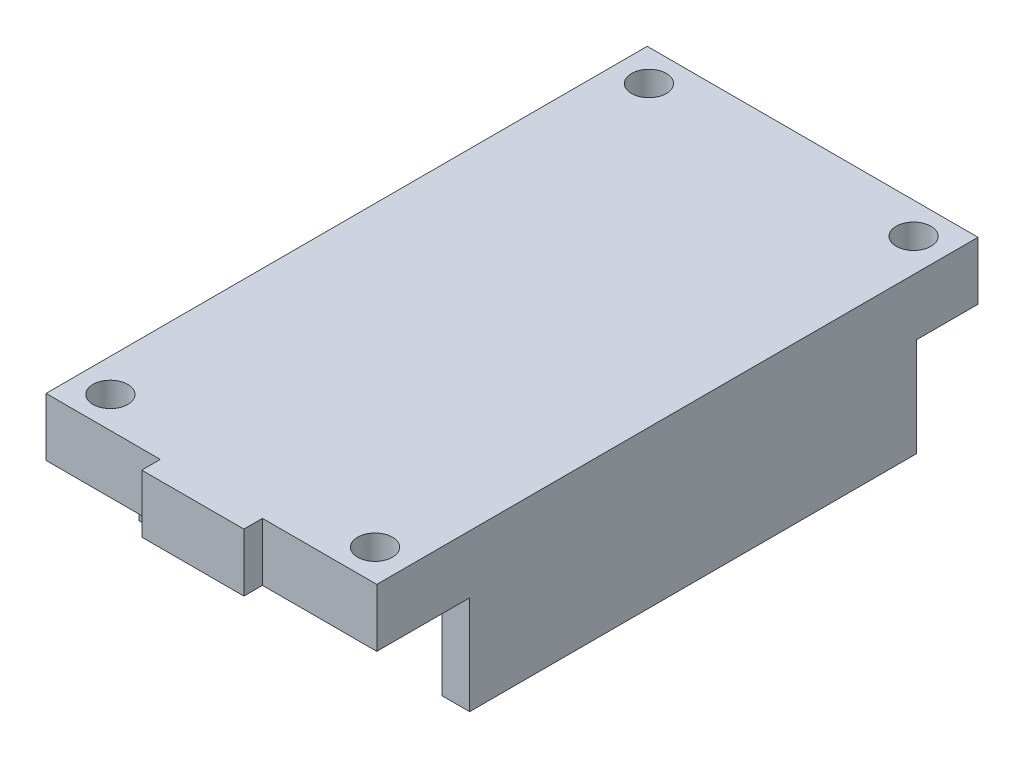
ISO-10303-21;
HEADER;
FILE_DESCRIPTION(('STEP AP214'),'2;1');
FILE_NAME('part.step','',(''),(''),'','','');
FILE_SCHEMA(('AUTOMOTIVE_DESIGN { 1 0 10303 214 1 1 1 1 }'));
ENDSEC;
DATA;
#1=APPLICATION_CONTEXT('core data for automotive mechanical design processes');
#2=APPLICATION_PROTOCOL_DEFINITION('international standard','automotive_design',2000,#1);
#3=PRODUCT_CONTEXT('',#1,'mechanical');
#4=PRODUCT('Part','Part','',(#3));
#5=PRODUCT_RELATED_PRODUCT_CATEGORY('part','',(#4));
#6=PRODUCT_DEFINITION_FORMATION('','',#4);
#7=PRODUCT_DEFINITION_CONTEXT('part definition',#1,'design');
#8=PRODUCT_DEFINITION('design','',#6,#7);
#9=PRODUCT_DEFINITION_SHAPE('','',#8);
#10=(LENGTH_UNIT() NAMED_UNIT(*) SI_UNIT(.MILLI.,.METRE.));
#11=(NAMED_UNIT(*) PLANE_ANGLE_UNIT() SI_UNIT($,.RADIAN.));
#12=(NAMED_UNIT(*) SI_UNIT($,.STERADIAN.) SOLID_ANGLE_UNIT());
#13=UNCERTAINTY_MEASURE_WITH_UNIT(LENGTH_MEASURE(1.E-05),#10,'distance_accuracy_value','');
#14=(GEOMETRIC_REPRESENTATION_CONTEXT(3) GLOBAL_UNCERTAINTY_ASSIGNED_CONTEXT((#13)) GLOBAL_UNIT_ASSIGNED_CONTEXT((#10,
#11,#12)) REPRESENTATION_CONTEXT('',''));
#15=CARTESIAN_POINT('',(0.,0.,0.));
#16=DIRECTION('',(0.,0.,1.));
#17=DIRECTION('',(1.,0.,0.));
#18=AXIS2_PLACEMENT_3D('',#15,#16,#17);
#19=CARTESIAN_POINT('',(0.,0.,0.));
#20=DIRECTION('',(0.,1.,0.));
#21=DIRECTION('',(0.,0.,1.));
#22=AXIS2_PLACEMENT_3D('',#19,#20,#21);
#23=PLANE('',#22);
#24=CARTESIAN_POINT('',(-11.4,0.,23.2));
#25=DIRECTION('',(0.,1.,0.));
#26=DIRECTION('',(0.,0.,1.));
#27=AXIS2_PLACEMENT_3D('',#24,#25,#26);
#28=CIRCLE('',#27,1.5);
#29=CARTESIAN_POINT('',(-11.4,0.,24.7));
#30=VERTEX_POINT('',#29);
#31=EDGE_CURVE('E248',#30,#30,#28,.T.);
#32=ORIENTED_EDGE('',*,*,#31,.T.);
#33=EDGE_LOOP('',(#32));
#34=FACE_BOUND('',#33,.T.);
#35=CARTESIAN_POINT('',(11.4,0.,23.2));
#36=DIRECTION('',(0.,1.,0.));
#37=DIRECTION('',(0.,0.,1.));
#38=AXIS2_PLACEMENT_3D('',#35,#36,#37);
#39=CIRCLE('',#38,1.5);
#40=CARTESIAN_POINT('',(11.4,0.,24.7));
#41=VERTEX_POINT('',#40);
#42=EDGE_CURVE('E294',#41,#41,#39,.T.);
#43=ORIENTED_EDGE('',*,*,#42,.T.);
#44=EDGE_LOOP('',(#43));
#45=FACE_BOUND('',#44,.T.);
#46=CARTESIAN_POINT('',(11.4,0.,-23.2));
#47=DIRECTION('',(0.,1.,0.));
#48=DIRECTION('',(0.,0.,1.));
#49=AXIS2_PLACEMENT_3D('',#46,#47,#48);
#50=CIRCLE('',#49,1.5);
#51=CARTESIAN_POINT('',(11.4,0.,-21.7));
#52=VERTEX_POINT('',#51);
#53=EDGE_CURVE('E298',#52,#52,#50,.T.);
#54=ORIENTED_EDGE('',*,*,#53,.T.);
#55=EDGE_LOOP('',(#54));
#56=FACE_BOUND('',#55,.T.);
#57=CARTESIAN_POINT('',(-11.4,0.,-23.2));
#58=DIRECTION('',(0.,1.,0.));
#59=DIRECTION('',(0.,0.,1.));
#60=AXIS2_PLACEMENT_3D('',#57,#58,#59);
#61=CIRCLE('',#60,1.5);
#62=CARTESIAN_POINT('',(-11.4,0.,-21.7));
#63=VERTEX_POINT('',#62);
#64=EDGE_CURVE('E302',#63,#63,#61,.T.);
#65=ORIENTED_EDGE('',*,*,#64,.T.);
#66=EDGE_LOOP('',(#65));
#67=FACE_BOUND('',#66,.T.);
#68=DIRECTION('',(1.,0.,0.));
#69=VECTOR('',#68,1.);
#70=CARTESIAN_POINT('',(-14.25,0.,-20.6));
#71=LINE('',#70,#69);
#72=CARTESIAN_POINT('',(-14.25,0.,-20.6));
#73=VERTEX_POINT('',#72);
#74=CARTESIAN_POINT('',(-11.85,0.,-20.6));
#75=VERTEX_POINT('',#74);
#76=EDGE_CURVE('E169',#73,#75,#71,.T.);
#77=ORIENTED_EDGE('',*,*,#76,.F.);
#78=DIRECTION('',(0.,0.,-1.));
#79=VECTOR('',#78,1.);
#80=CARTESIAN_POINT('',(-14.25,0.,0.));
#81=LINE('',#80,#79);
#82=CARTESIAN_POINT('',(-14.25,0.,-25.9));
#83=VERTEX_POINT('',#82);
#84=EDGE_CURVE('E155',#73,#83,#81,.T.);
#85=ORIENTED_EDGE('',*,*,#84,.T.);
#86=DIRECTION('',(1.,0.,0.));
#87=VECTOR('',#86,1.);
#88=CARTESIAN_POINT('',(0.,0.,-25.9));
#89=LINE('',#88,#87);
#90=CARTESIAN_POINT('',(14.25,0.,-25.9));
#91=VERTEX_POINT('',#90);
#92=EDGE_CURVE('E167',#83,#91,#89,.T.);
#93=ORIENTED_EDGE('',*,*,#92,.T.);
#94=DIRECTION('',(0.,0.,-1.));
#95=VECTOR('',#94,1.);
#96=CARTESIAN_POINT('',(14.25,0.,0.));
#97=LINE('',#96,#95);
#98=CARTESIAN_POINT('',(14.25,0.,-20.6));
#99=VERTEX_POINT('',#98);
#100=EDGE_CURVE('E326',#99,#91,#97,.T.);
#101=ORIENTED_EDGE('',*,*,#100,.F.);
#102=DIRECTION('',(1.,0.,0.));
#103=VECTOR('',#102,1.);
#104=CARTESIAN_POINT('',(14.25,0.,-20.6));
#105=LINE('',#104,#103);
#106=CARTESIAN_POINT('',(11.85,0.,-20.6));
#107=VERTEX_POINT('',#106);
#108=EDGE_CURVE('E174',#107,#99,#105,.T.);
#109=ORIENTED_EDGE('',*,*,#108,.F.);
#110=DIRECTION('',(0.,0.,-1.));
#111=VECTOR('',#110,1.);
#112=CARTESIAN_POINT('',(11.85,0.,17.9));
#113=LINE('',#112,#111);
#114=CARTESIAN_POINT('',(11.85,0.,17.9));
#115=VERTEX_POINT('',#114);
#116=EDGE_CURVE('E213',#115,#107,#113,.T.);
#117=ORIENTED_EDGE('',*,*,#116,.F.);
#118=DIRECTION('',(-1.,0.,0.));
#119=VECTOR('',#118,1.);
#120=CARTESIAN_POINT('',(14.25,0.,17.9));
#121=LINE('',#120,#119);
#122=CARTESIAN_POINT('',(14.25,0.,17.9));
#123=VERTEX_POINT('',#122);
#124=EDGE_CURVE('E226',#123,#115,#121,.T.);
#125=ORIENTED_EDGE('',*,*,#124,.F.);
#126=CARTESIAN_POINT('',(14.25,0.,25.9));
#127=VERTEX_POINT('',#126);
#128=EDGE_CURVE('E322',#127,#123,#97,.T.);
#129=ORIENTED_EDGE('',*,*,#128,.F.);
#130=DIRECTION('',(1.,0.,0.));
#131=VECTOR('',#130,1.);
#132=CARTESIAN_POINT('',(0.,0.,25.9));
#133=LINE('',#132,#131);
#134=CARTESIAN_POINT('',(4.4,0.,25.9));
#135=VERTEX_POINT('',#134);
#136=EDGE_CURVE('E311',#135,#127,#133,.T.);
#137=ORIENTED_EDGE('',*,*,#136,.F.);
#138=DIRECTION('',(0.,0.,1.));
#139=VECTOR('',#138,1.);
#140=CARTESIAN_POINT('',(4.4,0.,0.));
#141=LINE('',#140,#139);
#142=CARTESIAN_POINT('',(4.4,0.,27.5));
#143=VERTEX_POINT('',#142);
#144=EDGE_CURVE('E318',#135,#143,#141,.T.);
#145=ORIENTED_EDGE('',*,*,#144,.T.);
#146=DIRECTION('',(1.,0.,0.));
#147=VECTOR('',#146,1.);
#148=CARTESIAN_POINT('',(0.,0.,27.5));
#149=LINE('',#148,#147);
#150=CARTESIAN_POINT('',(-4.4,0.,27.5));
#151=VERTEX_POINT('',#150);
#152=EDGE_CURVE('E314',#151,#143,#149,.T.);
#153=ORIENTED_EDGE('',*,*,#152,.F.);
#154=DIRECTION('',(0.,0.,1.));
#155=VECTOR('',#154,1.);
#156=CARTESIAN_POINT('',(-4.4,0.,0.));
#157=LINE('',#156,#155);
#158=CARTESIAN_POINT('',(-4.4,0.,25.9));
#159=VERTEX_POINT('',#158);
#160=EDGE_CURVE('E310',#159,#151,#157,.T.);
#161=ORIENTED_EDGE('',*,*,#160,.F.);
#162=CARTESIAN_POINT('',(-14.25,0.,25.9));
#163=VERTEX_POINT('',#162);
#164=EDGE_CURVE('E306',#163,#159,#133,.T.);
#165=ORIENTED_EDGE('',*,*,#164,.F.);
#166=CARTESIAN_POINT('',(-14.25,0.,17.9));
#167=VERTEX_POINT('',#166);
#168=EDGE_CURVE('E166',#163,#167,#81,.T.);
#169=ORIENTED_EDGE('',*,*,#168,.T.);
#170=DIRECTION('',(-1.,0.,0.));
#171=VECTOR('',#170,1.);
#172=CARTESIAN_POINT('',(-14.25,0.,17.9));
#173=LINE('',#172,#171);
#174=CARTESIAN_POINT('',(-11.85,0.,17.9));
#175=VERTEX_POINT('',#174);
#176=EDGE_CURVE('E63',#175,#167,#173,.T.);
#177=ORIENTED_EDGE('',*,*,#176,.F.);
#178=DIRECTION('',(0.,0.,1.));
#179=VECTOR('',#178,1.);
#180=CARTESIAN_POINT('',(-11.85,0.,17.9));
#181=LINE('',#180,#179);
#182=EDGE_CURVE('E58',#75,#175,#181,.T.);
#183=ORIENTED_EDGE('',*,*,#182,.F.);
#184=EDGE_LOOP('',(#77,#85,#93,#101,#109,#117,#125,#129,#137,#145,#153,#161,#165,#169,#177,#183));
#185=FACE_BOUND('',#184,.T.);
#186=ADVANCED_FACE('F42',(#34,#45,#56,#67,#185),#23,.F.);
#187=CARTESIAN_POINT('',(0.,5.,25.9));
#188=DIRECTION('',(0.,0.,-1.));
#189=DIRECTION('',(-1.,0.,0.));
#190=AXIS2_PLACEMENT_3D('',#187,#188,#189);
#191=PLANE('',#190);
#192=ORIENTED_EDGE('',*,*,#164,.T.);
#193=DIRECTION('',(0.,-1.,0.));
#194=VECTOR('',#193,1.);
#195=CARTESIAN_POINT('',(-4.4,5.,25.9));
#196=LINE('',#195,#194);
#197=CARTESIAN_POINT('',(-4.4,5.,25.9));
#198=VERTEX_POINT('',#197);
#199=EDGE_CURVE('E11',#198,#159,#196,.T.);
#200=ORIENTED_EDGE('',*,*,#199,.F.);
#201=DIRECTION('',(1.,0.,0.));
#202=VECTOR('',#201,1.);
#203=CARTESIAN_POINT('',(0.,5.,25.9));
#204=LINE('',#203,#202);
#205=CARTESIAN_POINT('',(-14.25,5.,25.9));
#206=VERTEX_POINT('',#205);
#207=EDGE_CURVE('E265',#206,#198,#204,.T.);
#208=ORIENTED_EDGE('',*,*,#207,.F.);
#209=DIRECTION('',(0.,-1.,0.));
#210=VECTOR('',#209,1.);
#211=CARTESIAN_POINT('',(-14.25,5.,25.9));
#212=LINE('',#211,#210);
#213=EDGE_CURVE('E290',#206,#163,#212,.T.);
#214=ORIENTED_EDGE('',*,*,#213,.T.);
#215=EDGE_LOOP('',(#192,#200,#208,#214));
#216=FACE_BOUND('',#215,.T.);
#217=ADVANCED_FACE('F372',(#216),#191,.F.);
#218=CARTESIAN_POINT('',(-4.4,5.,0.));
#219=DIRECTION('',(1.,0.,0.));
#220=DIRECTION('',(0.,0.,-1.));
#221=AXIS2_PLACEMENT_3D('',#218,#219,#220);
#222=PLANE('',#221);
#223=ORIENTED_EDGE('',*,*,#160,.T.);
#224=DIRECTION('',(0.,-1.,0.));
#225=VECTOR('',#224,1.);
#226=CARTESIAN_POINT('',(-4.4,5.,27.5));
#227=LINE('',#226,#225);
#228=CARTESIAN_POINT('',(-4.4,5.,27.5));
#229=VERTEX_POINT('',#228);
#230=EDGE_CURVE('E51',#229,#151,#227,.T.);
#231=ORIENTED_EDGE('',*,*,#230,.F.);
#232=DIRECTION('',(0.,0.,1.));
#233=VECTOR('',#232,1.);
#234=CARTESIAN_POINT('',(-4.4,5.,0.));
#235=LINE('',#234,#233);
#236=EDGE_CURVE('E269',#198,#229,#235,.T.);
#237=ORIENTED_EDGE('',*,*,#236,.F.);
#238=ORIENTED_EDGE('',*,*,#199,.T.);
#239=EDGE_LOOP('',(#223,#231,#237,#238));
#240=FACE_BOUND('',#239,.T.);
#241=ADVANCED_FACE('F370',(#240),#222,.F.);
#242=CARTESIAN_POINT('',(0.,5.,27.5));
#243=DIRECTION('',(0.,0.,-1.));
#244=DIRECTION('',(-1.,0.,0.));
#245=AXIS2_PLACEMENT_3D('',#242,#243,#244);
#246=PLANE('',#245);
#247=ORIENTED_EDGE('',*,*,#152,.T.);
#248=DIRECTION('',(0.,-1.,0.));
#249=VECTOR('',#248,1.);
#250=CARTESIAN_POINT('',(4.4,5.,27.5));
#251=LINE('',#250,#249);
#252=CARTESIAN_POINT('',(4.4,5.,27.5));
#253=VERTEX_POINT('',#252);
#254=EDGE_CURVE('E345',#253,#143,#251,.T.);
#255=ORIENTED_EDGE('',*,*,#254,.F.);
#256=DIRECTION('',(1.,0.,0.));
#257=VECTOR('',#256,1.);
#258=CARTESIAN_POINT('',(0.,5.,27.5));
#259=LINE('',#258,#257);
#260=EDGE_CURVE('E273',#229,#253,#259,.T.);
#261=ORIENTED_EDGE('',*,*,#260,.F.);
#262=ORIENTED_EDGE('',*,*,#230,.T.);
#263=EDGE_LOOP('',(#247,#255,#261,#262));
#264=FACE_BOUND('',#263,.T.);
#265=ADVANCED_FACE('F353',(#264),#246,.F.);
#266=CARTESIAN_POINT('',(4.4,5.,0.));
#267=DIRECTION('',(1.,0.,0.));
#268=DIRECTION('',(0.,0.,-1.));
#269=AXIS2_PLACEMENT_3D('',#266,#267,#268);
#270=PLANE('',#269);
#271=ORIENTED_EDGE('',*,*,#144,.F.);
#272=DIRECTION('',(0.,-1.,0.));
#273=VECTOR('',#272,1.);
#274=CARTESIAN_POINT('',(4.4,5.,25.9));
#275=LINE('',#274,#273);
#276=CARTESIAN_POINT('',(4.4,5.,25.9));
#277=VERTEX_POINT('',#276);
#278=EDGE_CURVE('E342',#277,#135,#275,.T.);
#279=ORIENTED_EDGE('',*,*,#278,.F.);
#280=DIRECTION('',(0.,0.,1.));
#281=VECTOR('',#280,1.);
#282=CARTESIAN_POINT('',(4.4,5.,0.));
#283=LINE('',#282,#281);
#284=EDGE_CURVE('E276',#277,#253,#283,.T.);
#285=ORIENTED_EDGE('',*,*,#284,.T.);
#286=ORIENTED_EDGE('',*,*,#254,.T.);
#287=EDGE_LOOP('',(#271,#279,#285,#286));
#288=FACE_BOUND('',#287,.T.);
#289=ADVANCED_FACE('F361',(#288),#270,.T.);
#290=ORIENTED_EDGE('',*,*,#136,.T.);
#291=DIRECTION('',(0.,-1.,0.));
#292=VECTOR('',#291,1.);
#293=CARTESIAN_POINT('',(14.25,5.,25.9));
#294=LINE('',#293,#292);
#295=CARTESIAN_POINT('',(14.25,5.,25.9));
#296=VERTEX_POINT('',#295);
#297=EDGE_CURVE('E338',#296,#127,#294,.T.);
#298=ORIENTED_EDGE('',*,*,#297,.F.);
#299=EDGE_CURVE('E270',#277,#296,#204,.T.);
#300=ORIENTED_EDGE('',*,*,#299,.F.);
#301=ORIENTED_EDGE('',*,*,#278,.T.);
#302=EDGE_LOOP('',(#290,#298,#300,#301));
#303=FACE_BOUND('',#302,.T.);
#304=ADVANCED_FACE('F397',(#303),#191,.F.);
#305=CARTESIAN_POINT('',(14.25,5.,0.));
#306=DIRECTION('',(-1.,0.,0.));
#307=DIRECTION('',(0.,0.,1.));
#308=AXIS2_PLACEMENT_3D('',#305,#306,#307);
#309=PLANE('',#308);
#310=ORIENTED_EDGE('',*,*,#128,.T.);
#311=DIRECTION('',(0.,1.,0.));
#312=VECTOR('',#311,1.);
#313=CARTESIAN_POINT('',(14.25,-8.5,17.9));
#314=LINE('',#313,#312);
#315=CARTESIAN_POINT('',(14.25,-8.5,17.9));
#316=VERTEX_POINT('',#315);
#317=EDGE_CURVE('E240',#316,#123,#314,.T.);
#318=ORIENTED_EDGE('',*,*,#317,.F.);
#319=DIRECTION('',(0.,0.,1.));
#320=VECTOR('',#319,1.);
#321=CARTESIAN_POINT('',(14.25,-8.5,17.9));
#322=LINE('',#321,#320);
#323=CARTESIAN_POINT('',(14.25,-8.5,-20.6));
#324=VERTEX_POINT('',#323);
#325=EDGE_CURVE('E212',#324,#316,#322,.T.);
#326=ORIENTED_EDGE('',*,*,#325,.F.);
#327=DIRECTION('',(0.,1.,0.));
#328=VECTOR('',#327,1.);
#329=CARTESIAN_POINT('',(14.25,-8.5,-20.6));
#330=LINE('',#329,#328);
#331=EDGE_CURVE('E244',#324,#99,#330,.T.);
#332=ORIENTED_EDGE('',*,*,#331,.T.);
#333=ORIENTED_EDGE('',*,*,#100,.T.);
#334=DIRECTION('',(0.,-1.,0.));
#335=VECTOR('',#334,1.);
#336=CARTESIAN_POINT('',(14.25,5.,-25.9));
#337=LINE('',#336,#335);
#338=CARTESIAN_POINT('',(14.25,5.,-25.9));
#339=VERTEX_POINT('',#338);
#340=EDGE_CURVE('E334',#339,#91,#337,.T.);
#341=ORIENTED_EDGE('',*,*,#340,.F.);
#342=DIRECTION('',(0.,0.,-1.));
#343=VECTOR('',#342,1.);
#344=CARTESIAN_POINT('',(14.25,5.,0.));
#345=LINE('',#344,#343);
#346=EDGE_CURVE('E280',#296,#339,#345,.T.);
#347=ORIENTED_EDGE('',*,*,#346,.F.);
#348=ORIENTED_EDGE('',*,*,#297,.T.);
#349=EDGE_LOOP('',(#310,#318,#326,#332,#333,#341,#347,#348));
#350=FACE_BOUND('',#349,.T.);
#351=ADVANCED_FACE('F408',(#350),#309,.F.);
#352=CARTESIAN_POINT('',(0.,5.,-25.9));
#353=DIRECTION('',(0.,0.,-1.));
#354=DIRECTION('',(-1.,0.,0.));
#355=AXIS2_PLACEMENT_3D('',#352,#353,#354);
#356=PLANE('',#355);
#357=ORIENTED_EDGE('',*,*,#92,.F.);
#358=DIRECTION('',(0.,-1.,0.));
#359=VECTOR('',#358,1.);
#360=CARTESIAN_POINT('',(-14.25,5.,-25.9));
#361=LINE('',#360,#359);
#362=CARTESIAN_POINT('',(-14.25,5.,-25.9));
#363=VERTEX_POINT('',#362);
#364=EDGE_CURVE('E162',#363,#83,#361,.T.);
#365=ORIENTED_EDGE('',*,*,#364,.F.);
#366=DIRECTION('',(1.,0.,0.));
#367=VECTOR('',#366,1.);
#368=CARTESIAN_POINT('',(0.,5.,-25.9));
#369=LINE('',#368,#367);
#370=EDGE_CURVE('E283',#363,#339,#369,.T.);
#371=ORIENTED_EDGE('',*,*,#370,.T.);
#372=ORIENTED_EDGE('',*,*,#340,.T.);
#373=EDGE_LOOP('',(#357,#365,#371,#372));
#374=FACE_BOUND('',#373,.T.);
#375=ADVANCED_FACE('F404',(#374),#356,.T.);
#376=CARTESIAN_POINT('',(-11.4,5.,-23.2));
#377=DIRECTION('',(0.,-1.,0.));
#378=DIRECTION('',(0.,0.,-1.));
#379=AXIS2_PLACEMENT_3D('',#376,#377,#378);
#380=CYLINDRICAL_SURFACE('',#379,1.5);
#381=CARTESIAN_POINT('',(-11.4,5.,-23.2));
#382=DIRECTION('',(0.,1.,0.));
#383=DIRECTION('',(0.,0.,1.));
#384=AXIS2_PLACEMENT_3D('',#381,#382,#383);
#385=CIRCLE('',#384,1.5);
#386=CARTESIAN_POINT('',(-11.4,5.,-21.7));
#387=VERTEX_POINT('',#386);
#388=EDGE_CURVE('E261',#387,#387,#385,.T.);
#389=ORIENTED_EDGE('',*,*,#388,.T.);
#390=EDGE_LOOP('',(#389));
#391=FACE_BOUND('',#390,.T.);
#392=ORIENTED_EDGE('',*,*,#64,.F.);
#393=EDGE_LOOP('',(#392));
#394=FACE_BOUND('',#393,.T.);
#395=ADVANCED_FACE('F407',(#391,#394),#380,.F.);
#396=CARTESIAN_POINT('',(11.4,5.,-23.2));
#397=DIRECTION('',(0.,-1.,0.));
#398=DIRECTION('',(0.,0.,-1.));
#399=AXIS2_PLACEMENT_3D('',#396,#397,#398);
#400=CYLINDRICAL_SURFACE('',#399,1.5);
#401=CARTESIAN_POINT('',(11.4,5.,-23.2));
#402=DIRECTION('',(0.,1.,0.));
#403=DIRECTION('',(0.,0.,1.));
#404=AXIS2_PLACEMENT_3D('',#401,#402,#403);
#405=CIRCLE('',#404,1.5);
#406=CARTESIAN_POINT('',(11.4,5.,-21.7));
#407=VERTEX_POINT('',#406);
#408=EDGE_CURVE('E257',#407,#407,#405,.T.);
#409=ORIENTED_EDGE('',*,*,#408,.T.);
#410=EDGE_LOOP('',(#409));
#411=FACE_BOUND('',#410,.T.);
#412=ORIENTED_EDGE('',*,*,#53,.F.);
#413=EDGE_LOOP('',(#412));
#414=FACE_BOUND('',#413,.T.);
#415=ADVANCED_FACE('F423',(#411,#414),#400,.F.);
#416=CARTESIAN_POINT('',(11.4,5.,23.2));
#417=DIRECTION('',(0.,-1.,0.));
#418=DIRECTION('',(0.,0.,-1.));
#419=AXIS2_PLACEMENT_3D('',#416,#417,#418);
#420=CYLINDRICAL_SURFACE('',#419,1.5);
#421=CARTESIAN_POINT('',(11.4,5.,23.2));
#422=DIRECTION('',(0.,1.,0.));
#423=DIRECTION('',(0.,0.,1.));
#424=AXIS2_PLACEMENT_3D('',#421,#422,#423);
#425=CIRCLE('',#424,1.5);
#426=CARTESIAN_POINT('',(11.4,5.,24.7));
#427=VERTEX_POINT('',#426);
#428=EDGE_CURVE('E253',#427,#427,#425,.T.);
#429=ORIENTED_EDGE('',*,*,#428,.T.);
#430=EDGE_LOOP('',(#429));
#431=FACE_BOUND('',#430,.T.);
#432=ORIENTED_EDGE('',*,*,#42,.F.);
#433=EDGE_LOOP('',(#432));
#434=FACE_BOUND('',#433,.T.);
#435=ADVANCED_FACE('F426',(#431,#434),#420,.F.);
#436=CARTESIAN_POINT('',(-11.4,5.,23.2));
#437=DIRECTION('',(0.,-1.,0.));
#438=DIRECTION('',(0.,0.,-1.));
#439=AXIS2_PLACEMENT_3D('',#436,#437,#438);
#440=CYLINDRICAL_SURFACE('',#439,1.5);
#441=CARTESIAN_POINT('',(-11.4,5.,23.2));
#442=DIRECTION('',(0.,1.,0.));
#443=DIRECTION('',(0.,0.,1.));
#444=AXIS2_PLACEMENT_3D('',#441,#442,#443);
#445=CIRCLE('',#444,1.5);
#446=CARTESIAN_POINT('',(-11.4,5.,24.7));
#447=VERTEX_POINT('',#446);
#448=EDGE_CURVE('E249',#447,#447,#445,.T.);
#449=ORIENTED_EDGE('',*,*,#448,.T.);
#450=EDGE_LOOP('',(#449));
#451=FACE_BOUND('',#450,.T.);
#452=ORIENTED_EDGE('',*,*,#31,.F.);
#453=EDGE_LOOP('',(#452));
#454=FACE_BOUND('',#453,.T.);
#455=ADVANCED_FACE('F44',(#451,#454),#440,.F.);
#456=CARTESIAN_POINT('',(-14.25,5.,0.));
#457=DIRECTION('',(-1.,0.,0.));
#458=DIRECTION('',(0.,0.,1.));
#459=AXIS2_PLACEMENT_3D('',#456,#457,#458);
#460=PLANE('',#459);
#461=ORIENTED_EDGE('',*,*,#168,.F.);
#462=ORIENTED_EDGE('',*,*,#213,.F.);
#463=DIRECTION('',(0.,0.,-1.));
#464=VECTOR('',#463,1.);
#465=CARTESIAN_POINT('',(-14.25,5.,0.));
#466=LINE('',#465,#464);
#467=EDGE_CURVE('E287',#206,#363,#466,.T.);
#468=ORIENTED_EDGE('',*,*,#467,.T.);
#469=ORIENTED_EDGE('',*,*,#364,.T.);
#470=ORIENTED_EDGE('',*,*,#84,.F.);
#471=DIRECTION('',(0.,1.,0.));
#472=VECTOR('',#471,1.);
#473=CARTESIAN_POINT('',(-14.25,-8.5,-20.6));
#474=LINE('',#473,#472);
#475=CARTESIAN_POINT('',(-14.25,-8.5,-20.6));
#476=VERTEX_POINT('',#475);
#477=EDGE_CURVE('E160',#476,#73,#474,.T.);
#478=ORIENTED_EDGE('',*,*,#477,.F.);
#479=DIRECTION('',(0.,0.,-1.));
#480=VECTOR('',#479,1.);
#481=CARTESIAN_POINT('',(-14.25,-8.5,17.9));
#482=LINE('',#481,#480);
#483=CARTESIAN_POINT('',(-14.25,-8.5,17.9));
#484=VERTEX_POINT('',#483);
#485=EDGE_CURVE('E196',#484,#476,#482,.T.);
#486=ORIENTED_EDGE('',*,*,#485,.F.);
#487=DIRECTION('',(0.,1.,0.));
#488=VECTOR('',#487,1.);
#489=CARTESIAN_POINT('',(-14.25,-8.5,17.9));
#490=LINE('',#489,#488);
#491=EDGE_CURVE('E189',#484,#167,#490,.T.);
#492=ORIENTED_EDGE('',*,*,#491,.T.);
#493=EDGE_LOOP('',(#461,#462,#468,#469,#470,#478,#486,#492));
#494=FACE_BOUND('',#493,.T.);
#495=ADVANCED_FACE('F157',(#494),#460,.T.);
#496=CARTESIAN_POINT('',(0.,5.,0.));
#497=DIRECTION('',(0.,1.,0.));
#498=DIRECTION('',(0.,0.,1.));
#499=AXIS2_PLACEMENT_3D('',#496,#497,#498);
#500=PLANE('',#499);
#501=ORIENTED_EDGE('',*,*,#448,.F.);
#502=EDGE_LOOP('',(#501));
#503=FACE_BOUND('',#502,.T.);
#504=ORIENTED_EDGE('',*,*,#428,.F.);
#505=EDGE_LOOP('',(#504));
#506=FACE_BOUND('',#505,.T.);
#507=ORIENTED_EDGE('',*,*,#408,.F.);
#508=EDGE_LOOP('',(#507));
#509=FACE_BOUND('',#508,.T.);
#510=ORIENTED_EDGE('',*,*,#388,.F.);
#511=EDGE_LOOP('',(#510));
#512=FACE_BOUND('',#511,.T.);
#513=ORIENTED_EDGE('',*,*,#207,.T.);
#514=ORIENTED_EDGE('',*,*,#236,.T.);
#515=ORIENTED_EDGE('',*,*,#260,.T.);
#516=ORIENTED_EDGE('',*,*,#284,.F.);
#517=ORIENTED_EDGE('',*,*,#299,.T.);
#518=ORIENTED_EDGE('',*,*,#346,.T.);
#519=ORIENTED_EDGE('',*,*,#370,.F.);
#520=ORIENTED_EDGE('',*,*,#467,.F.);
#521=EDGE_LOOP('',(#513,#514,#515,#516,#517,#518,#519,#520));
#522=FACE_BOUND('',#521,.T.);
#523=ADVANCED_FACE('F365',(#503,#506,#509,#512,#522),#500,.T.);
#524=CARTESIAN_POINT('',(14.25,-8.5,-20.6));
#525=DIRECTION('',(0.,0.,1.));
#526=DIRECTION('',(1.,0.,0.));
#527=AXIS2_PLACEMENT_3D('',#524,#525,#526);
#528=PLANE('',#527);
#529=ORIENTED_EDGE('',*,*,#108,.T.);
#530=ORIENTED_EDGE('',*,*,#331,.F.);
#531=DIRECTION('',(1.,0.,0.));
#532=VECTOR('',#531,1.);
#533=CARTESIAN_POINT('',(14.25,-8.5,-20.6));
#534=LINE('',#533,#532);
#535=CARTESIAN_POINT('',(11.85,-8.5,-20.6));
#536=VERTEX_POINT('',#535);
#537=EDGE_CURVE('E208',#536,#324,#534,.T.);
#538=ORIENTED_EDGE('',*,*,#537,.F.);
#539=DIRECTION('',(0.,1.,0.));
#540=VECTOR('',#539,1.);
#541=CARTESIAN_POINT('',(11.85,-8.5,-20.6));
#542=LINE('',#541,#540);
#543=EDGE_CURVE('E222',#536,#107,#542,.T.);
#544=ORIENTED_EDGE('',*,*,#543,.T.);
#545=EDGE_LOOP('',(#529,#530,#538,#544));
#546=FACE_BOUND('',#545,.T.);
#547=ADVANCED_FACE('F446',(#546),#528,.F.);
#548=CARTESIAN_POINT('',(14.25,-8.5,17.9));
#549=DIRECTION('',(0.,0.,-1.));
#550=DIRECTION('',(-1.,0.,0.));
#551=AXIS2_PLACEMENT_3D('',#548,#549,#550);
#552=PLANE('',#551);
#553=ORIENTED_EDGE('',*,*,#124,.T.);
#554=DIRECTION('',(0.,1.,0.));
#555=VECTOR('',#554,1.);
#556=CARTESIAN_POINT('',(11.85,-8.5,17.9));
#557=LINE('',#556,#555);
#558=CARTESIAN_POINT('',(11.85,-8.5,17.9));
#559=VERTEX_POINT('',#558);
#560=EDGE_CURVE('E236',#559,#115,#557,.T.);
#561=ORIENTED_EDGE('',*,*,#560,.F.);
#562=DIRECTION('',(-1.,0.,0.));
#563=VECTOR('',#562,1.);
#564=CARTESIAN_POINT('',(14.25,-8.5,17.9));
#565=LINE('',#564,#563);
#566=EDGE_CURVE('E216',#316,#559,#565,.T.);
#567=ORIENTED_EDGE('',*,*,#566,.F.);
#568=ORIENTED_EDGE('',*,*,#317,.T.);
#569=EDGE_LOOP('',(#553,#561,#567,#568));
#570=FACE_BOUND('',#569,.T.);
#571=ADVANCED_FACE('F454',(#570),#552,.F.);
#572=CARTESIAN_POINT('',(11.85,-8.5,17.9));
#573=DIRECTION('',(1.,0.,0.));
#574=DIRECTION('',(0.,0.,-1.));
#575=AXIS2_PLACEMENT_3D('',#572,#573,#574);
#576=PLANE('',#575);
#577=ORIENTED_EDGE('',*,*,#116,.T.);
#578=ORIENTED_EDGE('',*,*,#543,.F.);
#579=DIRECTION('',(0.,0.,-1.));
#580=VECTOR('',#579,1.);
#581=CARTESIAN_POINT('',(11.85,-8.5,17.9));
#582=LINE('',#581,#580);
#583=EDGE_CURVE('E219',#559,#536,#582,.T.);
#584=ORIENTED_EDGE('',*,*,#583,.F.);
#585=ORIENTED_EDGE('',*,*,#560,.T.);
#586=EDGE_LOOP('',(#577,#578,#584,#585));
#587=FACE_BOUND('',#586,.T.);
#588=ADVANCED_FACE('F462',(#587),#576,.F.);
#589=CARTESIAN_POINT('',(0.,-8.5,0.));
#590=DIRECTION('',(0.,-1.,0.));
#591=DIRECTION('',(0.,0.,-1.));
#592=AXIS2_PLACEMENT_3D('',#589,#590,#591);
#593=PLANE('',#592);
#594=ORIENTED_EDGE('',*,*,#537,.T.);
#595=ORIENTED_EDGE('',*,*,#325,.T.);
#596=ORIENTED_EDGE('',*,*,#566,.T.);
#597=ORIENTED_EDGE('',*,*,#583,.T.);
#598=EDGE_LOOP('',(#594,#595,#596,#597));
#599=FACE_BOUND('',#598,.T.);
#600=ADVANCED_FACE('F467',(#599),#593,.T.);
#601=CARTESIAN_POINT('',(-14.25,-8.5,-20.6));
#602=DIRECTION('',(0.,0.,1.));
#603=DIRECTION('',(1.,0.,0.));
#604=AXIS2_PLACEMENT_3D('',#601,#602,#603);
#605=PLANE('',#604);
#606=ORIENTED_EDGE('',*,*,#76,.T.);
#607=DIRECTION('',(0.,1.,0.));
#608=VECTOR('',#607,1.);
#609=CARTESIAN_POINT('',(-11.85,-8.5,-20.6));
#610=LINE('',#609,#608);
#611=CARTESIAN_POINT('',(-11.85,-8.5,-20.6));
#612=VERTEX_POINT('',#611);
#613=EDGE_CURVE('E180',#612,#75,#610,.T.);
#614=ORIENTED_EDGE('',*,*,#613,.F.);
#615=DIRECTION('',(1.,0.,0.));
#616=VECTOR('',#615,1.);
#617=CARTESIAN_POINT('',(-14.25,-8.5,-20.6));
#618=LINE('',#617,#616);
#619=EDGE_CURVE('E177',#476,#612,#618,.T.);
#620=ORIENTED_EDGE('',*,*,#619,.F.);
#621=ORIENTED_EDGE('',*,*,#477,.T.);
#622=EDGE_LOOP('',(#606,#614,#620,#621));
#623=FACE_BOUND('',#622,.T.);
#624=ADVANCED_FACE('F176',(#623),#605,.F.);
#625=CARTESIAN_POINT('',(-11.85,-8.5,17.9));
#626=DIRECTION('',(-1.,0.,0.));
#627=DIRECTION('',(0.,0.,1.));
#628=AXIS2_PLACEMENT_3D('',#625,#626,#627);
#629=PLANE('',#628);
#630=ORIENTED_EDGE('',*,*,#182,.T.);
#631=DIRECTION('',(0.,1.,0.));
#632=VECTOR('',#631,1.);
#633=CARTESIAN_POINT('',(-11.85,-8.5,17.9));
#634=LINE('',#633,#632);
#635=CARTESIAN_POINT('',(-11.85,-8.5,17.9));
#636=VERTEX_POINT('',#635);
#637=EDGE_CURVE('E183',#636,#175,#634,.T.);
#638=ORIENTED_EDGE('',*,*,#637,.F.);
#639=DIRECTION('',(0.,0.,1.));
#640=VECTOR('',#639,1.);
#641=CARTESIAN_POINT('',(-11.85,-8.5,17.9));
#642=LINE('',#641,#640);
#643=EDGE_CURVE('E201',#612,#636,#642,.T.);
#644=ORIENTED_EDGE('',*,*,#643,.F.);
#645=ORIENTED_EDGE('',*,*,#613,.T.);
#646=EDGE_LOOP('',(#630,#638,#644,#645));
#647=FACE_BOUND('',#646,.T.);
#648=ADVANCED_FACE('F380',(#647),#629,.F.);
#649=CARTESIAN_POINT('',(-14.25,-8.5,17.9));
#650=DIRECTION('',(0.,0.,-1.));
#651=DIRECTION('',(-1.,0.,0.));
#652=AXIS2_PLACEMENT_3D('',#649,#650,#651);
#653=PLANE('',#652);
#654=ORIENTED_EDGE('',*,*,#176,.T.);
#655=ORIENTED_EDGE('',*,*,#491,.F.);
#656=DIRECTION('',(-1.,0.,0.));
#657=VECTOR('',#656,1.);
#658=CARTESIAN_POINT('',(-14.25,-8.5,17.9));
#659=LINE('',#658,#657);
#660=EDGE_CURVE('E193',#636,#484,#659,.T.);
#661=ORIENTED_EDGE('',*,*,#660,.F.);
#662=ORIENTED_EDGE('',*,*,#637,.T.);
#663=EDGE_LOOP('',(#654,#655,#661,#662));
#664=FACE_BOUND('',#663,.T.);
#665=ADVANCED_FACE('F376',(#664),#653,.F.);
#666=CARTESIAN_POINT('',(0.,-8.5,0.));
#667=DIRECTION('',(0.,-1.,0.));
#668=DIRECTION('',(0.,0.,-1.));
#669=AXIS2_PLACEMENT_3D('',#666,#667,#668);
#670=PLANE('',#669);
#671=ORIENTED_EDGE('',*,*,#485,.T.);
#672=ORIENTED_EDGE('',*,*,#619,.T.);
#673=ORIENTED_EDGE('',*,*,#643,.T.);
#674=ORIENTED_EDGE('',*,*,#660,.T.);
#675=EDGE_LOOP('',(#671,#672,#673,#674));
#676=FACE_BOUND('',#675,.T.);
#677=ADVANCED_FACE('F382',(#676),#670,.T.);
#678=CLOSED_SHELL('',(#186,#217,#241,#265,#289,#304,#351,#375,#395,#415,#435,#455,#495,#523,
#547,#571,#588,#600,#624,#648,#665,#677));
#679=MANIFOLD_SOLID_BREP('B2',#678);
#680=ADVANCED_BREP_SHAPE_REPRESENTATION('',(#18,#679),#14);
#681=SHAPE_DEFINITION_REPRESENTATION(#9,#680);
ENDSEC;
END-ISO-10303-21;
